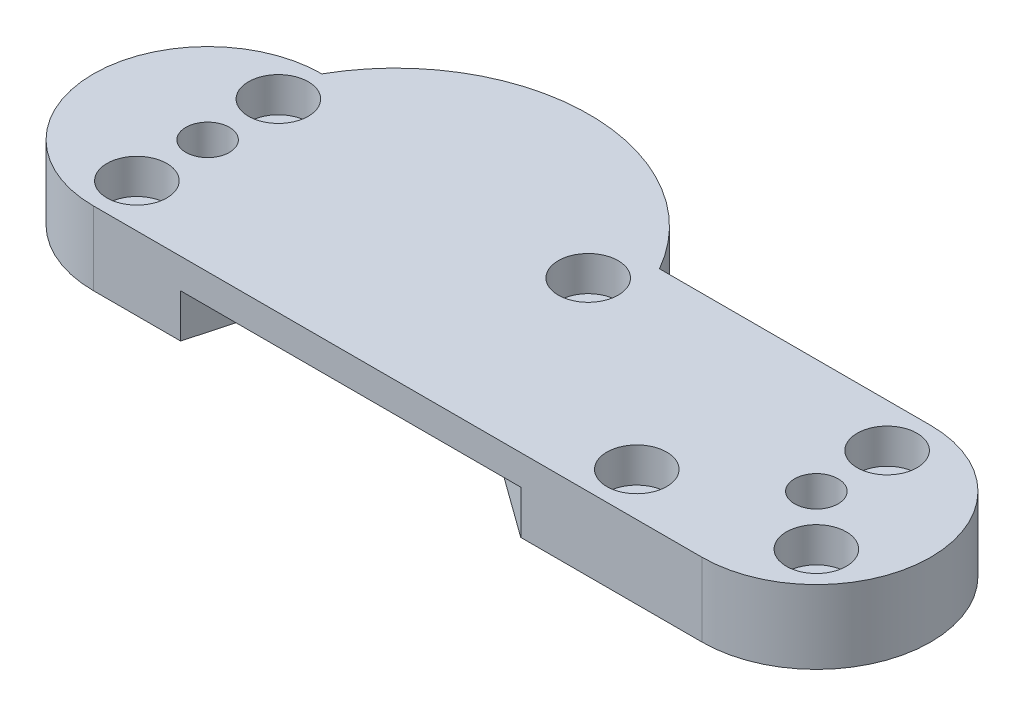
ISO-10303-21;
HEADER;
FILE_DESCRIPTION(('STEP AP214'),'2;1');
FILE_NAME('part.step','',(''),(''),'','','');
FILE_SCHEMA(('AUTOMOTIVE_DESIGN { 1 0 10303 214 1 1 1 1 }'));
ENDSEC;
DATA;
#1=APPLICATION_CONTEXT('core data for automotive mechanical design processes');
#2=APPLICATION_PROTOCOL_DEFINITION('international standard','automotive_design',2000,#1);
#3=PRODUCT_CONTEXT('',#1,'mechanical');
#4=PRODUCT('Part','Part','',(#3));
#5=PRODUCT_RELATED_PRODUCT_CATEGORY('part','',(#4));
#6=PRODUCT_DEFINITION_FORMATION('','',#4);
#7=PRODUCT_DEFINITION_CONTEXT('part definition',#1,'design');
#8=PRODUCT_DEFINITION('design','',#6,#7);
#9=PRODUCT_DEFINITION_SHAPE('','',#8);
#10=(LENGTH_UNIT() NAMED_UNIT(*) SI_UNIT(.MILLI.,.METRE.));
#11=(NAMED_UNIT(*) PLANE_ANGLE_UNIT() SI_UNIT($,.RADIAN.));
#12=(NAMED_UNIT(*) SI_UNIT($,.STERADIAN.) SOLID_ANGLE_UNIT());
#13=UNCERTAINTY_MEASURE_WITH_UNIT(LENGTH_MEASURE(1.E-05),#10,'distance_accuracy_value','');
#14=(GEOMETRIC_REPRESENTATION_CONTEXT(3) GLOBAL_UNCERTAINTY_ASSIGNED_CONTEXT((#13)) GLOBAL_UNIT_ASSIGNED_CONTEXT((#10,
#11,#12)) REPRESENTATION_CONTEXT('',''));
#15=CARTESIAN_POINT('',(0.,0.,0.));
#16=DIRECTION('',(0.,0.,1.));
#17=DIRECTION('',(1.,0.,0.));
#18=AXIS2_PLACEMENT_3D('',#15,#16,#17);
#19=CARTESIAN_POINT('',(0.,-2.,0.));
#20=DIRECTION('',(0.,1.,0.));
#21=DIRECTION('',(0.,0.,-1.));
#22=AXIS2_PLACEMENT_3D('',#19,#20,#21);
#23=PLANE('',#22);
#24=CARTESIAN_POINT('',(-10.,-2.,6.5003992165423));
#25=DIRECTION('',(0.,-1.,0.));
#26=DIRECTION('',(0.,0.,-1.));
#27=AXIS2_PLACEMENT_3D('',#24,#25,#26);
#28=CIRCLE('',#27,1.5);
#29=CARTESIAN_POINT('',(-10.,-2.,5.0003992165423));
#30=VERTEX_POINT('',#29);
#31=EDGE_CURVE('E294',#30,#30,#28,.F.);
#32=ORIENTED_EDGE('',*,*,#31,.T.);
#33=EDGE_LOOP('',(#32));
#34=FACE_BOUND('',#33,.T.);
#35=CARTESIAN_POINT('',(0.,-2.,-6.50039921654231));
#36=DIRECTION('',(0.,-1.,0.));
#37=DIRECTION('',(0.,0.,-1.));
#38=AXIS2_PLACEMENT_3D('',#35,#36,#37);
#39=CIRCLE('',#38,1.5);
#40=CARTESIAN_POINT('',(0.,-2.,-8.00039921654231));
#41=VERTEX_POINT('',#40);
#42=EDGE_CURVE('E266',#41,#41,#39,.F.);
#43=ORIENTED_EDGE('',*,*,#42,.T.);
#44=EDGE_LOOP('',(#43));
#45=FACE_BOUND('',#44,.T.);
#46=CARTESIAN_POINT('',(0.,-2.,0.));
#47=DIRECTION('',(0.,-1.,0.));
#48=DIRECTION('',(0.,0.,-1.));
#49=AXIS2_PLACEMENT_3D('',#46,#47,#48);
#50=CIRCLE('',#49,2.);
#51=CARTESIAN_POINT('',(0.,-2.,-2.));
#52=VERTEX_POINT('',#51);
#53=EDGE_CURVE('E52',#52,#52,#50,.T.);
#54=ORIENTED_EDGE('',*,*,#53,.F.);
#55=EDGE_LOOP('',(#54));
#56=FACE_BOUND('',#55,.T.);
#57=CARTESIAN_POINT('',(0.,-2.,0.));
#58=DIRECTION('',(0.,-1.,0.));
#59=DIRECTION('',(0.,0.,-1.));
#60=AXIS2_PLACEMENT_3D('',#57,#58,#59);
#61=CIRCLE('',#60,10.5003992165423);
#62=CARTESIAN_POINT('',(0.,-2.,-10.5003992165423));
#63=VERTEX_POINT('',#62);
#64=CARTESIAN_POINT('',(0.,-2.,10.5003992165423));
#65=VERTEX_POINT('',#64);
#66=EDGE_CURVE('E273',#63,#65,#61,.T.);
#67=ORIENTED_EDGE('',*,*,#66,.T.);
#68=DIRECTION('',(-1.,0.,0.));
#69=VECTOR('',#68,1.);
#70=CARTESIAN_POINT('',(0.,-2.,10.5003992165423));
#71=LINE('',#70,#69);
#72=CARTESIAN_POINT('',(-16.659276720951,-2.,10.5003992165423));
#73=VERTEX_POINT('',#72);
#74=EDGE_CURVE('E272',#65,#73,#71,.T.);
#75=ORIENTED_EDGE('',*,*,#74,.T.);
#76=DIRECTION('',(-0.810372315489383,0.,-0.585915275691269));
#77=VECTOR('',#76,1.);
#78=CARTESIAN_POINT('',(26.6452391554762,-2.,41.8104240945407));
#79=LINE('',#78,#77);
#80=CARTESIAN_POINT('',(-39.2995259463282,-2.,-5.86895054165502));
#81=VERTEX_POINT('',#80);
#82=EDGE_CURVE('E166',#73,#81,#79,.T.);
#83=ORIENTED_EDGE('',*,*,#82,.T.);
#84=DIRECTION('',(0.263153614525288,0.,-0.964753945398658));
#85=VECTOR('',#84,1.);
#86=CARTESIAN_POINT('',(-35.7518279113757,-2.,-18.8752536565782));
#87=LINE('',#86,#85);
#88=CARTESIAN_POINT('',(-35.7381547906292,-2.,-18.9253810211969));
#89=VERTEX_POINT('',#88);
#90=EDGE_CURVE('E178',#81,#89,#87,.T.);
#91=ORIENTED_EDGE('',*,*,#90,.T.);
#92=CARTESIAN_POINT('',(-40.4241193156667,-2.,-1.7460511013579));
#93=DIRECTION('',(0.,-1.,0.));
#94=DIRECTION('',(0.,0.,-1.));
#95=AXIS2_PLACEMENT_3D('',#92,#93,#94);
#96=CIRCLE('',#95,17.8069548217708);
#97=CARTESIAN_POINT('',(-24.917700351162,-2.,-10.5003992165423));
#98=VERTEX_POINT('',#97);
#99=EDGE_CURVE('E153',#89,#98,#96,.T.);
#100=ORIENTED_EDGE('',*,*,#99,.T.);
#101=DIRECTION('',(1.,0.,0.));
#102=VECTOR('',#101,1.);
#103=CARTESIAN_POINT('',(0.,-2.,-10.5003992165423));
#104=LINE('',#103,#102);
#105=EDGE_CURVE('E268',#98,#63,#104,.T.);
#106=ORIENTED_EDGE('',*,*,#105,.T.);
#107=EDGE_LOOP('',(#67,#75,#83,#91,#100,#106));
#108=FACE_BOUND('',#107,.T.);
#109=CARTESIAN_POINT('',(4.59647636643678,-2.,4.59647636643679));
#110=DIRECTION('',(0.,-1.,0.));
#111=DIRECTION('',(0.,0.,-1.));
#112=AXIS2_PLACEMENT_3D('',#109,#110,#111);
#113=CIRCLE('',#112,1.5);
#114=CARTESIAN_POINT('',(4.59647636643678,-2.,3.09647636643679));
#115=VERTEX_POINT('',#114);
#116=EDGE_CURVE('E290',#115,#115,#113,.F.);
#117=ORIENTED_EDGE('',*,*,#116,.T.);
#118=EDGE_LOOP('',(#117));
#119=FACE_BOUND('',#118,.T.);
#120=CARTESIAN_POINT('',(-27.4615510728353,-2.,-6.5003992165423));
#121=DIRECTION('',(0.,-1.,0.));
#122=DIRECTION('',(0.,0.,-1.));
#123=AXIS2_PLACEMENT_3D('',#120,#121,#122);
#124=CIRCLE('',#123,1.5);
#125=CARTESIAN_POINT('',(-27.4615510728353,-2.,-8.00039921654231));
#126=VERTEX_POINT('',#125);
#127=EDGE_CURVE('E46',#126,#126,#124,.F.);
#128=ORIENTED_EDGE('',*,*,#127,.T.);
#129=EDGE_LOOP('',(#128));
#130=FACE_BOUND('',#129,.T.);
#131=ADVANCED_FACE('F43',(#34,#45,#56,#108,#119,#130),#23,.F.);
#132=CARTESIAN_POINT('',(-55.9305382801715,-2.,6.5003992165423));
#133=DIRECTION('',(0.,-1.,0.));
#134=DIRECTION('',(0.,0.,-1.));
#135=AXIS2_PLACEMENT_3D('',#132,#133,#134);
#136=CIRCLE('',#135,1.5);
#137=CARTESIAN_POINT('',(-55.9305382801715,-2.,5.0003992165423));
#138=VERTEX_POINT('',#137);
#139=EDGE_CURVE('E298',#138,#138,#136,.F.);
#140=ORIENTED_EDGE('',*,*,#139,.T.);
#141=EDGE_LOOP('',(#140));
#142=FACE_BOUND('',#141,.T.);
#143=CARTESIAN_POINT('',(-55.9305382801715,-2.,0.));
#144=DIRECTION('',(0.,-1.,0.));
#145=DIRECTION('',(0.,0.,-1.));
#146=AXIS2_PLACEMENT_3D('',#143,#144,#145);
#147=CIRCLE('',#146,2.);
#148=CARTESIAN_POINT('',(-55.9305382801715,-2.,-2.));
#149=VERTEX_POINT('',#148);
#150=EDGE_CURVE('E11',#149,#149,#147,.T.);
#151=ORIENTED_EDGE('',*,*,#150,.F.);
#152=EDGE_LOOP('',(#151));
#153=FACE_BOUND('',#152,.T.);
#154=CARTESIAN_POINT('',(-55.9305382801715,-2.,0.));
#155=DIRECTION('',(0.,-1.,0.));
#156=DIRECTION('',(0.,0.,-1.));
#157=AXIS2_PLACEMENT_3D('',#154,#155,#156);
#158=CIRCLE('',#157,10.5003992165423);
#159=CARTESIAN_POINT('',(-55.9305382801715,-2.,10.5003992165423));
#160=VERTEX_POINT('',#159);
#161=CARTESIAN_POINT('',(-55.9305382801715,-2.,-10.5003992165423));
#162=VERTEX_POINT('',#161);
#163=EDGE_CURVE('E239',#160,#162,#158,.T.);
#164=ORIENTED_EDGE('',*,*,#163,.T.);
#165=CARTESIAN_POINT('',(-54.8543825263999,-2.,-12.1794179449777));
#166=VERTEX_POINT('',#165);
#167=EDGE_CURVE('E267',#162,#166,#96,.T.);
#168=ORIENTED_EDGE('',*,*,#167,.T.);
#169=DIRECTION('',(0.810372315489383,0.,0.585915275691269));
#170=VECTOR('',#169,1.);
#171=CARTESIAN_POINT('',(-43.8872651072943,-2.,-4.24997427651618));
#172=LINE('',#171,#170);
#173=CARTESIAN_POINT('',(-43.8872651072943,-2.,-4.24997427651618));
#174=VERTEX_POINT('',#173);
#175=EDGE_CURVE('E181',#166,#174,#172,.T.);
#176=ORIENTED_EDGE('',*,*,#175,.T.);
#177=DIRECTION('',(-0.263153614525289,0.,0.964753945398657));
#178=VECTOR('',#177,1.);
#179=CARTESIAN_POINT('',(-43.8872651072943,-2.,-4.24997427651618));
#180=LINE('',#179,#178);
#181=CARTESIAN_POINT('',(-47.9106890267398,-2.,10.5003992165423));
#182=VERTEX_POINT('',#181);
#183=EDGE_CURVE('E168',#174,#182,#180,.T.);
#184=ORIENTED_EDGE('',*,*,#183,.T.);
#185=EDGE_CURVE('E277',#182,#160,#71,.T.);
#186=ORIENTED_EDGE('',*,*,#185,.T.);
#187=EDGE_LOOP('',(#164,#168,#176,#184,#186));
#188=FACE_BOUND('',#187,.T.);
#189=CARTESIAN_POINT('',(-55.9305382801715,-2.,-6.5003992165423));
#190=DIRECTION('',(0.,-1.,0.));
#191=DIRECTION('',(0.,0.,-1.));
#192=AXIS2_PLACEMENT_3D('',#189,#190,#191);
#193=CIRCLE('',#192,1.5);
#194=CARTESIAN_POINT('',(-55.9305382801715,-2.,-8.00039921654231));
#195=VERTEX_POINT('',#194);
#196=EDGE_CURVE('E301',#195,#195,#193,.F.);
#197=ORIENTED_EDGE('',*,*,#196,.T.);
#198=EDGE_LOOP('',(#197));
#199=FACE_BOUND('',#198,.T.);
#200=ADVANCED_FACE('F315',(#142,#153,#188,#199),#23,.F.);
#201=CARTESIAN_POINT('',(-27.4615510728353,-4.75,-6.5003992165423));
#202=DIRECTION('',(0.,1.,0.));
#203=DIRECTION('',(0.,0.,-1.));
#204=AXIS2_PLACEMENT_3D('',#201,#202,#203);
#205=CYLINDRICAL_SURFACE('',#204,1.5);
#206=ORIENTED_EDGE('',*,*,#127,.F.);
#207=EDGE_LOOP('',(#206));
#208=FACE_BOUND('',#207,.T.);
#209=CARTESIAN_POINT('',(-27.4615510728353,1.55,-6.5003992165423));
#210=DIRECTION('',(0.,-1.,0.));
#211=DIRECTION('',(0.,0.,-1.));
#212=AXIS2_PLACEMENT_3D('',#209,#210,#211);
#213=CIRCLE('',#212,1.5);
#214=CARTESIAN_POINT('',(-27.4615510728353,1.55,-8.00039921654231));
#215=VERTEX_POINT('',#214);
#216=EDGE_CURVE('E149',#215,#215,#213,.F.);
#217=ORIENTED_EDGE('',*,*,#216,.T.);
#218=EDGE_LOOP('',(#217));
#219=FACE_BOUND('',#218,.T.);
#220=ADVANCED_FACE('F311',(#208,#219),#205,.F.);
#221=CARTESIAN_POINT('',(-55.9305382801715,-4.75,-6.5003992165423));
#222=DIRECTION('',(0.,1.,0.));
#223=DIRECTION('',(0.,0.,-1.));
#224=AXIS2_PLACEMENT_3D('',#221,#222,#223);
#225=CYLINDRICAL_SURFACE('',#224,1.5);
#226=ORIENTED_EDGE('',*,*,#196,.F.);
#227=EDGE_LOOP('',(#226));
#228=FACE_BOUND('',#227,.T.);
#229=CARTESIAN_POINT('',(-55.9305382801715,1.55,-6.5003992165423));
#230=DIRECTION('',(0.,-1.,0.));
#231=DIRECTION('',(0.,0.,-1.));
#232=AXIS2_PLACEMENT_3D('',#229,#230,#231);
#233=CIRCLE('',#232,1.5);
#234=CARTESIAN_POINT('',(-55.9305382801715,1.55,-8.00039921654231));
#235=VERTEX_POINT('',#234);
#236=EDGE_CURVE('E257',#235,#235,#233,.F.);
#237=ORIENTED_EDGE('',*,*,#236,.T.);
#238=EDGE_LOOP('',(#237));
#239=FACE_BOUND('',#238,.T.);
#240=ADVANCED_FACE('F314',(#228,#239),#225,.F.);
#241=CARTESIAN_POINT('',(-55.9305382801715,-4.75,6.5003992165423));
#242=DIRECTION('',(0.,1.,0.));
#243=DIRECTION('',(0.,0.,-1.));
#244=AXIS2_PLACEMENT_3D('',#241,#242,#243);
#245=CYLINDRICAL_SURFACE('',#244,1.5);
#246=ORIENTED_EDGE('',*,*,#139,.F.);
#247=EDGE_LOOP('',(#246));
#248=FACE_BOUND('',#247,.T.);
#249=CARTESIAN_POINT('',(-55.9305382801715,1.55,6.5003992165423));
#250=DIRECTION('',(0.,-1.,0.));
#251=DIRECTION('',(0.,0.,-1.));
#252=AXIS2_PLACEMENT_3D('',#249,#250,#251);
#253=CIRCLE('',#252,1.5);
#254=CARTESIAN_POINT('',(-55.9305382801715,1.55,5.0003992165423));
#255=VERTEX_POINT('',#254);
#256=EDGE_CURVE('E253',#255,#255,#253,.F.);
#257=ORIENTED_EDGE('',*,*,#256,.T.);
#258=EDGE_LOOP('',(#257));
#259=FACE_BOUND('',#258,.T.);
#260=ADVANCED_FACE('F389',(#248,#259),#245,.F.);
#261=CARTESIAN_POINT('',(-10.,-4.75,6.5003992165423));
#262=DIRECTION('',(0.,1.,0.));
#263=DIRECTION('',(0.,0.,-1.));
#264=AXIS2_PLACEMENT_3D('',#261,#262,#263);
#265=CYLINDRICAL_SURFACE('',#264,1.5);
#266=ORIENTED_EDGE('',*,*,#31,.F.);
#267=EDGE_LOOP('',(#266));
#268=FACE_BOUND('',#267,.T.);
#269=CARTESIAN_POINT('',(-10.,1.55,6.5003992165423));
#270=DIRECTION('',(0.,-1.,0.));
#271=DIRECTION('',(0.,0.,-1.));
#272=AXIS2_PLACEMENT_3D('',#269,#270,#271);
#273=CIRCLE('',#272,1.5);
#274=CARTESIAN_POINT('',(-10.,1.55,5.0003992165423));
#275=VERTEX_POINT('',#274);
#276=EDGE_CURVE('E249',#275,#275,#273,.F.);
#277=ORIENTED_EDGE('',*,*,#276,.T.);
#278=EDGE_LOOP('',(#277));
#279=FACE_BOUND('',#278,.T.);
#280=ADVANCED_FACE('F354',(#268,#279),#265,.F.);
#281=CARTESIAN_POINT('',(4.59647636643678,-4.75,4.59647636643679));
#282=DIRECTION('',(0.,1.,0.));
#283=DIRECTION('',(0.,0.,-1.));
#284=AXIS2_PLACEMENT_3D('',#281,#282,#283);
#285=CYLINDRICAL_SURFACE('',#284,1.5);
#286=ORIENTED_EDGE('',*,*,#116,.F.);
#287=EDGE_LOOP('',(#286));
#288=FACE_BOUND('',#287,.T.);
#289=CARTESIAN_POINT('',(4.59647636643678,1.55,4.59647636643679));
#290=DIRECTION('',(0.,-1.,0.));
#291=DIRECTION('',(0.,0.,-1.));
#292=AXIS2_PLACEMENT_3D('',#289,#290,#291);
#293=CIRCLE('',#292,1.5);
#294=CARTESIAN_POINT('',(4.59647636643678,1.55,3.09647636643679));
#295=VERTEX_POINT('',#294);
#296=EDGE_CURVE('E244',#295,#295,#293,.F.);
#297=ORIENTED_EDGE('',*,*,#296,.T.);
#298=EDGE_LOOP('',(#297));
#299=FACE_BOUND('',#298,.T.);
#300=ADVANCED_FACE('F350',(#288,#299),#285,.F.);
#301=CARTESIAN_POINT('',(0.,-4.75,-6.50039921654231));
#302=DIRECTION('',(0.,1.,0.));
#303=DIRECTION('',(0.,0.,-1.));
#304=AXIS2_PLACEMENT_3D('',#301,#302,#303);
#305=CYLINDRICAL_SURFACE('',#304,1.5);
#306=ORIENTED_EDGE('',*,*,#42,.F.);
#307=EDGE_LOOP('',(#306));
#308=FACE_BOUND('',#307,.T.);
#309=CARTESIAN_POINT('',(0.,1.55,-6.50039921654231));
#310=DIRECTION('',(0.,-1.,0.));
#311=DIRECTION('',(0.,0.,-1.));
#312=AXIS2_PLACEMENT_3D('',#309,#310,#311);
#313=CIRCLE('',#312,1.5);
#314=CARTESIAN_POINT('',(0.,1.55,-8.00039921654231));
#315=VERTEX_POINT('',#314);
#316=EDGE_CURVE('E240',#315,#315,#313,.F.);
#317=ORIENTED_EDGE('',*,*,#316,.T.);
#318=EDGE_LOOP('',(#317));
#319=FACE_BOUND('',#318,.T.);
#320=ADVANCED_FACE('F353',(#308,#319),#305,.F.);
#321=CARTESIAN_POINT('',(-40.4241193156667,-37.0570550282,-1.7460511013579));
#322=DIRECTION('',(0.,1.,0.));
#323=DIRECTION('',(0.,0.,-1.));
#324=AXIS2_PLACEMENT_3D('',#321,#322,#323);
#325=CYLINDRICAL_SURFACE('',#324,17.8069548217708);
#326=DIRECTION('',(0.,-1.,0.));
#327=VECTOR('',#326,1.);
#328=CARTESIAN_POINT('',(-35.7381547906292,2.,-18.9253810211969));
#329=LINE('',#328,#327);
#330=CARTESIAN_POINT('',(-35.7381547906292,2.,-18.9253810211969));
#331=VERTEX_POINT('',#330);
#332=EDGE_CURVE('E136',#331,#89,#329,.T.);
#333=ORIENTED_EDGE('',*,*,#332,.F.);
#334=CARTESIAN_POINT('',(-40.4241193156667,2.,-1.7460511013579));
#335=DIRECTION('',(0.,1.,0.));
#336=DIRECTION('',(0.,0.,1.));
#337=AXIS2_PLACEMENT_3D('',#334,#335,#336);
#338=CIRCLE('',#337,17.8069548217708);
#339=CARTESIAN_POINT('',(-54.8543825263999,2.,-12.1794179449777));
#340=VERTEX_POINT('',#339);
#341=EDGE_CURVE('E144',#331,#340,#338,.T.);
#342=ORIENTED_EDGE('',*,*,#341,.T.);
#343=DIRECTION('',(0.,-1.,0.));
#344=VECTOR('',#343,1.);
#345=CARTESIAN_POINT('',(-54.8543825263999,2.,-12.1794179449777));
#346=LINE('',#345,#344);
#347=EDGE_CURVE('E156',#340,#166,#346,.T.);
#348=ORIENTED_EDGE('',*,*,#347,.T.);
#349=ORIENTED_EDGE('',*,*,#167,.F.);
#350=DIRECTION('',(0.,1.,0.));
#351=VECTOR('',#350,1.);
#352=CARTESIAN_POINT('',(-55.9305382801715,-4.75,-10.5003992165423));
#353=LINE('',#352,#351);
#354=CARTESIAN_POINT('',(-55.9305382801715,4.75,-10.5003992165423));
#355=VERTEX_POINT('',#354);
#356=EDGE_CURVE('E220',#162,#355,#353,.T.);
#357=ORIENTED_EDGE('',*,*,#356,.T.);
#358=CARTESIAN_POINT('',(-40.4241193156667,4.75,-1.7460511013579));
#359=DIRECTION('',(0.,1.,0.));
#360=DIRECTION('',(0.,0.,1.));
#361=AXIS2_PLACEMENT_3D('',#358,#359,#360);
#362=CIRCLE('',#361,17.8069548217708);
#363=CARTESIAN_POINT('',(-24.917700351162,4.75,-10.5003992165423));
#364=VERTEX_POINT('',#363);
#365=EDGE_CURVE('E159',#355,#364,#362,.F.);
#366=ORIENTED_EDGE('',*,*,#365,.T.);
#367=DIRECTION('',(0.,1.,0.));
#368=VECTOR('',#367,1.);
#369=CARTESIAN_POINT('',(-24.917700351162,-37.0570550282,-10.5003992165423));
#370=LINE('',#369,#368);
#371=EDGE_CURVE('E60',#98,#364,#370,.T.);
#372=ORIENTED_EDGE('',*,*,#371,.F.);
#373=ORIENTED_EDGE('',*,*,#99,.F.);
#374=EDGE_LOOP('',(#333,#342,#348,#349,#357,#366,#372,#373));
#375=FACE_BOUND('',#374,.T.);
#376=ADVANCED_FACE('F151',(#375),#325,.T.);
#377=CARTESIAN_POINT('',(0.,-4.75,-10.5003992165423));
#378=DIRECTION('',(0.,0.,1.));
#379=DIRECTION('',(1.,0.,0.));
#380=AXIS2_PLACEMENT_3D('',#377,#378,#379);
#381=PLANE('',#380);
#382=ORIENTED_EDGE('',*,*,#371,.T.);
#383=DIRECTION('',(-1.,0.,0.));
#384=VECTOR('',#383,1.);
#385=CARTESIAN_POINT('',(0.,4.75,-10.5003992165423));
#386=LINE('',#385,#384);
#387=CARTESIAN_POINT('',(0.,4.75,-10.5003992165423));
#388=VERTEX_POINT('',#387);
#389=EDGE_CURVE('E204',#388,#364,#386,.T.);
#390=ORIENTED_EDGE('',*,*,#389,.F.);
#391=DIRECTION('',(0.,1.,0.));
#392=VECTOR('',#391,1.);
#393=CARTESIAN_POINT('',(0.,-4.75,-10.5003992165423));
#394=LINE('',#393,#392);
#395=EDGE_CURVE('E224',#63,#388,#394,.T.);
#396=ORIENTED_EDGE('',*,*,#395,.F.);
#397=ORIENTED_EDGE('',*,*,#105,.F.);
#398=EDGE_LOOP('',(#382,#390,#396,#397));
#399=FACE_BOUND('',#398,.T.);
#400=ADVANCED_FACE('F402',(#399),#381,.F.);
#401=CARTESIAN_POINT('',(0.,-4.75,10.5003992165423));
#402=DIRECTION('',(0.,0.,-1.));
#403=DIRECTION('',(-1.,0.,0.));
#404=AXIS2_PLACEMENT_3D('',#401,#402,#403);
#405=PLANE('',#404);
#406=DIRECTION('',(0.,1.,0.));
#407=VECTOR('',#406,1.);
#408=CARTESIAN_POINT('',(0.,-4.75,10.5003992165423));
#409=LINE('',#408,#407);
#410=CARTESIAN_POINT('',(0.,4.75,10.5003992165423));
#411=VERTEX_POINT('',#410);
#412=EDGE_CURVE('E68',#65,#411,#409,.T.);
#413=ORIENTED_EDGE('',*,*,#412,.T.);
#414=DIRECTION('',(1.,0.,0.));
#415=VECTOR('',#414,1.);
#416=CARTESIAN_POINT('',(0.,4.75,10.5003992165423));
#417=LINE('',#416,#415);
#418=CARTESIAN_POINT('',(-55.9305382801715,4.75,10.5003992165423));
#419=VERTEX_POINT('',#418);
#420=EDGE_CURVE('E210',#419,#411,#417,.T.);
#421=ORIENTED_EDGE('',*,*,#420,.F.);
#422=DIRECTION('',(0.,1.,0.));
#423=VECTOR('',#422,1.);
#424=CARTESIAN_POINT('',(-55.9305382801715,-4.75,10.5003992165423));
#425=LINE('',#424,#423);
#426=EDGE_CURVE('E216',#160,#419,#425,.T.);
#427=ORIENTED_EDGE('',*,*,#426,.F.);
#428=ORIENTED_EDGE('',*,*,#185,.F.);
#429=DIRECTION('',(0.,-1.,0.));
#430=VECTOR('',#429,1.);
#431=CARTESIAN_POINT('',(-47.9106890267398,-4.75,10.5003992165423));
#432=LINE('',#431,#430);
#433=CARTESIAN_POINT('',(-47.9106890267398,2.,10.5003992165423));
#434=VERTEX_POINT('',#433);
#435=EDGE_CURVE('E228',#434,#182,#432,.T.);
#436=ORIENTED_EDGE('',*,*,#435,.F.);
#437=DIRECTION('',(1.,0.,0.));
#438=VECTOR('',#437,1.);
#439=CARTESIAN_POINT('',(0.,2.,10.5003992165423));
#440=LINE('',#439,#438);
#441=CARTESIAN_POINT('',(-16.659276720951,2.,10.5003992165423));
#442=VERTEX_POINT('',#441);
#443=EDGE_CURVE('E235',#434,#442,#440,.T.);
#444=ORIENTED_EDGE('',*,*,#443,.T.);
#445=DIRECTION('',(0.,1.,0.));
#446=VECTOR('',#445,1.);
#447=CARTESIAN_POINT('',(-16.659276720951,-4.75,10.5003992165423));
#448=LINE('',#447,#446);
#449=EDGE_CURVE('E231',#73,#442,#448,.T.);
#450=ORIENTED_EDGE('',*,*,#449,.F.);
#451=ORIENTED_EDGE('',*,*,#74,.F.);
#452=EDGE_LOOP('',(#413,#421,#427,#428,#436,#444,#450,#451));
#453=FACE_BOUND('',#452,.T.);
#454=ADVANCED_FACE('F432',(#453),#405,.F.);
#455=CARTESIAN_POINT('',(0.,4.75,0.));
#456=DIRECTION('',(0.,-1.,0.));
#457=DIRECTION('',(0.,0.,1.));
#458=AXIS2_PLACEMENT_3D('',#455,#456,#457);
#459=PLANE('',#458);
#460=CARTESIAN_POINT('',(-55.9305382801715,4.75,-6.5003992165423));
#461=DIRECTION('',(0.,-1.,0.));
#462=DIRECTION('',(0.,0.,-1.));
#463=AXIS2_PLACEMENT_3D('',#460,#461,#462);
#464=CIRCLE('',#463,2.75);
#465=CARTESIAN_POINT('',(-55.9305382801715,4.75,-9.2503992165423));
#466=VERTEX_POINT('',#465);
#467=EDGE_CURVE('E589',#466,#466,#464,.T.);
#468=ORIENTED_EDGE('',*,*,#467,.T.);
#469=EDGE_LOOP('',(#468));
#470=FACE_BOUND('',#469,.T.);
#471=CARTESIAN_POINT('',(-27.4615510728353,4.75,-6.5003992165423));
#472=DIRECTION('',(0.,-1.,0.));
#473=DIRECTION('',(0.,0.,-1.));
#474=AXIS2_PLACEMENT_3D('',#471,#472,#473);
#475=CIRCLE('',#474,2.75);
#476=CARTESIAN_POINT('',(-27.4615510728353,4.75,-9.2503992165423));
#477=VERTEX_POINT('',#476);
#478=EDGE_CURVE('E605',#477,#477,#475,.T.);
#479=ORIENTED_EDGE('',*,*,#478,.T.);
#480=EDGE_LOOP('',(#479));
#481=FACE_BOUND('',#480,.T.);
#482=CARTESIAN_POINT('',(-10.,4.75,6.5003992165423));
#483=DIRECTION('',(0.,-1.,0.));
#484=DIRECTION('',(0.,0.,-1.));
#485=AXIS2_PLACEMENT_3D('',#482,#483,#484);
#486=CIRCLE('',#485,2.75);
#487=CARTESIAN_POINT('',(-10.,4.75,3.7503992165423));
#488=VERTEX_POINT('',#487);
#489=EDGE_CURVE('E613',#488,#488,#486,.T.);
#490=ORIENTED_EDGE('',*,*,#489,.T.);
#491=EDGE_LOOP('',(#490));
#492=FACE_BOUND('',#491,.T.);
#493=CARTESIAN_POINT('',(4.59647636643678,4.75,4.59647636643679));
#494=DIRECTION('',(0.,-1.,0.));
#495=DIRECTION('',(0.,0.,-1.));
#496=AXIS2_PLACEMENT_3D('',#493,#494,#495);
#497=CIRCLE('',#496,2.75);
#498=CARTESIAN_POINT('',(4.59647636643678,4.75,1.84647636643679));
#499=VERTEX_POINT('',#498);
#500=EDGE_CURVE('E621',#499,#499,#497,.T.);
#501=ORIENTED_EDGE('',*,*,#500,.T.);
#502=EDGE_LOOP('',(#501));
#503=FACE_BOUND('',#502,.T.);
#504=CARTESIAN_POINT('',(0.,4.75,-6.50039921654231));
#505=DIRECTION('',(0.,-1.,0.));
#506=DIRECTION('',(0.,0.,-1.));
#507=AXIS2_PLACEMENT_3D('',#504,#505,#506);
#508=CIRCLE('',#507,2.75);
#509=CARTESIAN_POINT('',(0.,4.75,-9.2503992165423));
#510=VERTEX_POINT('',#509);
#511=EDGE_CURVE('E599',#510,#510,#508,.T.);
#512=ORIENTED_EDGE('',*,*,#511,.T.);
#513=EDGE_LOOP('',(#512));
#514=FACE_BOUND('',#513,.T.);
#515=CARTESIAN_POINT('',(-55.9305382801715,4.75,6.5003992165423));
#516=DIRECTION('',(0.,-1.,0.));
#517=DIRECTION('',(0.,0.,-1.));
#518=AXIS2_PLACEMENT_3D('',#515,#516,#517);
#519=CIRCLE('',#518,2.75);
#520=CARTESIAN_POINT('',(-55.9305382801715,4.75,3.7503992165423));
#521=VERTEX_POINT('',#520);
#522=EDGE_CURVE('E588',#521,#521,#519,.T.);
#523=ORIENTED_EDGE('',*,*,#522,.T.);
#524=EDGE_LOOP('',(#523));
#525=FACE_BOUND('',#524,.T.);
#526=CARTESIAN_POINT('',(0.,4.75,0.));
#527=DIRECTION('',(0.,1.,0.));
#528=DIRECTION('',(0.,0.,1.));
#529=AXIS2_PLACEMENT_3D('',#526,#527,#528);
#530=CIRCLE('',#529,10.5003992165423);
#531=EDGE_CURVE('E201',#411,#388,#530,.T.);
#532=ORIENTED_EDGE('',*,*,#531,.T.);
#533=ORIENTED_EDGE('',*,*,#389,.T.);
#534=ORIENTED_EDGE('',*,*,#365,.F.);
#535=CARTESIAN_POINT('',(-55.9305382801715,4.75,0.));
#536=DIRECTION('',(0.,1.,0.));
#537=DIRECTION('',(0.,0.,1.));
#538=AXIS2_PLACEMENT_3D('',#535,#536,#537);
#539=CIRCLE('',#538,10.5003992165423);
#540=EDGE_CURVE('E207',#355,#419,#539,.T.);
#541=ORIENTED_EDGE('',*,*,#540,.T.);
#542=ORIENTED_EDGE('',*,*,#420,.T.);
#543=EDGE_LOOP('',(#532,#533,#534,#541,#542));
#544=FACE_BOUND('',#543,.T.);
#545=CARTESIAN_POINT('',(0.,4.75,0.));
#546=DIRECTION('',(0.,1.,0.));
#547=DIRECTION('',(0.,0.,1.));
#548=AXIS2_PLACEMENT_3D('',#545,#546,#547);
#549=CIRCLE('',#548,2.);
#550=CARTESIAN_POINT('',(0.,4.75,2.));
#551=VERTEX_POINT('',#550);
#552=EDGE_CURVE('E197',#551,#551,#549,.T.);
#553=ORIENTED_EDGE('',*,*,#552,.F.);
#554=EDGE_LOOP('',(#553));
#555=FACE_BOUND('',#554,.T.);
#556=CARTESIAN_POINT('',(-55.9305382801715,4.75,0.));
#557=DIRECTION('',(0.,1.,0.));
#558=DIRECTION('',(0.,0.,1.));
#559=AXIS2_PLACEMENT_3D('',#556,#557,#558);
#560=CIRCLE('',#559,2.);
#561=CARTESIAN_POINT('',(-55.9305382801715,4.75,2.));
#562=VERTEX_POINT('',#561);
#563=EDGE_CURVE('E191',#562,#562,#560,.T.);
#564=ORIENTED_EDGE('',*,*,#563,.F.);
#565=EDGE_LOOP('',(#564));
#566=FACE_BOUND('',#565,.T.);
#567=ADVANCED_FACE('F428',(#470,#481,#492,#503,#514,#525,#544,#555,#566),#459,.F.);
#568=CARTESIAN_POINT('',(0.,-4.75,0.));
#569=DIRECTION('',(0.,1.,0.));
#570=DIRECTION('',(0.,0.,-1.));
#571=AXIS2_PLACEMENT_3D('',#568,#569,#570);
#572=CYLINDRICAL_SURFACE('',#571,10.5003992165423);
#573=ORIENTED_EDGE('',*,*,#395,.T.);
#574=ORIENTED_EDGE('',*,*,#531,.F.);
#575=ORIENTED_EDGE('',*,*,#412,.F.);
#576=ORIENTED_EDGE('',*,*,#66,.F.);
#577=EDGE_LOOP('',(#573,#574,#575,#576));
#578=FACE_BOUND('',#577,.T.);
#579=ADVANCED_FACE('F431',(#578),#572,.T.);
#580=CARTESIAN_POINT('',(-55.9305382801715,-4.75,0.));
#581=DIRECTION('',(0.,1.,0.));
#582=DIRECTION('',(0.,0.,-1.));
#583=AXIS2_PLACEMENT_3D('',#580,#581,#582);
#584=CYLINDRICAL_SURFACE('',#583,10.5003992165423);
#585=ORIENTED_EDGE('',*,*,#426,.T.);
#586=ORIENTED_EDGE('',*,*,#540,.F.);
#587=ORIENTED_EDGE('',*,*,#356,.F.);
#588=ORIENTED_EDGE('',*,*,#163,.F.);
#589=EDGE_LOOP('',(#585,#586,#587,#588));
#590=FACE_BOUND('',#589,.T.);
#591=ADVANCED_FACE('F426',(#590),#584,.T.);
#592=CARTESIAN_POINT('',(0.,-4.75,0.));
#593=DIRECTION('',(0.,1.,0.));
#594=DIRECTION('',(0.,0.,-1.));
#595=AXIS2_PLACEMENT_3D('',#592,#593,#594);
#596=CYLINDRICAL_SURFACE('',#595,2.);
#597=ORIENTED_EDGE('',*,*,#53,.T.);
#598=EDGE_LOOP('',(#597));
#599=FACE_BOUND('',#598,.T.);
#600=ORIENTED_EDGE('',*,*,#552,.T.);
#601=EDGE_LOOP('',(#600));
#602=FACE_BOUND('',#601,.T.);
#603=ADVANCED_FACE('F422',(#599,#602),#596,.F.);
#604=CARTESIAN_POINT('',(-55.9305382801715,-4.75,0.));
#605=DIRECTION('',(0.,1.,0.));
#606=DIRECTION('',(0.,0.,-1.));
#607=AXIS2_PLACEMENT_3D('',#604,#605,#606);
#608=CYLINDRICAL_SURFACE('',#607,2.);
#609=ORIENTED_EDGE('',*,*,#150,.T.);
#610=EDGE_LOOP('',(#609));
#611=FACE_BOUND('',#610,.T.);
#612=ORIENTED_EDGE('',*,*,#563,.T.);
#613=EDGE_LOOP('',(#612));
#614=FACE_BOUND('',#613,.T.);
#615=ADVANCED_FACE('F413',(#611,#614),#608,.F.);
#616=CARTESIAN_POINT('',(-43.8872651072943,2.,-4.24997427651618));
#617=DIRECTION('',(-0.585915275691269,0.,0.810372315489383));
#618=DIRECTION('',(0.810372315489383,0.,0.585915275691269));
#619=AXIS2_PLACEMENT_3D('',#616,#617,#618);
#620=PLANE('',#619);
#621=ORIENTED_EDGE('',*,*,#175,.F.);
#622=ORIENTED_EDGE('',*,*,#347,.F.);
#623=DIRECTION('',(0.810372315489383,0.,0.585915275691269));
#624=VECTOR('',#623,1.);
#625=CARTESIAN_POINT('',(-43.8872651072943,2.,-4.24997427651618));
#626=LINE('',#625,#624);
#627=CARTESIAN_POINT('',(-43.8872651072943,2.,-4.24997427651618));
#628=VERTEX_POINT('',#627);
#629=EDGE_CURVE('E140',#340,#628,#626,.T.);
#630=ORIENTED_EDGE('',*,*,#629,.T.);
#631=DIRECTION('',(0.,-1.,0.));
#632=VECTOR('',#631,1.);
#633=CARTESIAN_POINT('',(-43.8872651072943,2.,-4.24997427651618));
#634=LINE('',#633,#632);
#635=EDGE_CURVE('E188',#628,#174,#634,.T.);
#636=ORIENTED_EDGE('',*,*,#635,.T.);
#637=EDGE_LOOP('',(#621,#622,#630,#636));
#638=FACE_BOUND('',#637,.T.);
#639=ADVANCED_FACE('F410',(#638),#620,.F.);
#640=CARTESIAN_POINT('',(-35.7518279113757,2.,-18.8752536565782));
#641=DIRECTION('',(0.964753945398658,0.,0.263153614525288));
#642=DIRECTION('',(0.263153614525288,0.,-0.964753945398658));
#643=AXIS2_PLACEMENT_3D('',#640,#641,#642);
#644=PLANE('',#643);
#645=DIRECTION('',(0.263153614525288,0.,-0.964753945398658));
#646=VECTOR('',#645,1.);
#647=CARTESIAN_POINT('',(-35.7518279113757,2.,-18.8752536565782));
#648=LINE('',#647,#646);
#649=CARTESIAN_POINT('',(-39.2995259463282,2.,-5.86895054165502));
#650=VERTEX_POINT('',#649);
#651=EDGE_CURVE('E131',#650,#331,#648,.T.);
#652=ORIENTED_EDGE('',*,*,#651,.T.);
#653=ORIENTED_EDGE('',*,*,#332,.T.);
#654=ORIENTED_EDGE('',*,*,#90,.F.);
#655=DIRECTION('',(0.,-1.,0.));
#656=VECTOR('',#655,1.);
#657=CARTESIAN_POINT('',(-39.2995259463282,2.,-5.86895054165502));
#658=LINE('',#657,#656);
#659=EDGE_CURVE('E137',#650,#81,#658,.T.);
#660=ORIENTED_EDGE('',*,*,#659,.F.);
#661=EDGE_LOOP('',(#652,#653,#654,#660));
#662=FACE_BOUND('',#661,.T.);
#663=ADVANCED_FACE('F133',(#662),#644,.F.);
#664=CARTESIAN_POINT('',(26.6452391554762,2.,41.8104240945407));
#665=DIRECTION('',(0.585915275691269,0.,-0.810372315489383));
#666=DIRECTION('',(-0.810372315489383,0.,-0.585915275691269));
#667=AXIS2_PLACEMENT_3D('',#664,#665,#666);
#668=PLANE('',#667);
#669=ORIENTED_EDGE('',*,*,#82,.F.);
#670=ORIENTED_EDGE('',*,*,#449,.T.);
#671=DIRECTION('',(-0.810372315489383,0.,-0.585915275691269));
#672=VECTOR('',#671,1.);
#673=CARTESIAN_POINT('',(26.6452391554762,2.,41.8104240945407));
#674=LINE('',#673,#672);
#675=EDGE_CURVE('E141',#442,#650,#674,.T.);
#676=ORIENTED_EDGE('',*,*,#675,.T.);
#677=ORIENTED_EDGE('',*,*,#659,.T.);
#678=EDGE_LOOP('',(#669,#670,#676,#677));
#679=FACE_BOUND('',#678,.T.);
#680=ADVANCED_FACE('F408',(#679),#668,.F.);
#681=CARTESIAN_POINT('',(-43.8872651072943,2.,-4.24997427651618));
#682=DIRECTION('',(-0.964753945398657,0.,-0.263153614525289));
#683=DIRECTION('',(-0.263153614525289,0.,0.964753945398657));
#684=AXIS2_PLACEMENT_3D('',#681,#682,#683);
#685=PLANE('',#684);
#686=DIRECTION('',(-0.263153614525289,0.,0.964753945398657));
#687=VECTOR('',#686,1.);
#688=CARTESIAN_POINT('',(-43.8872651072943,2.,-4.24997427651618));
#689=LINE('',#688,#687);
#690=EDGE_CURVE('E172',#628,#434,#689,.T.);
#691=ORIENTED_EDGE('',*,*,#690,.T.);
#692=ORIENTED_EDGE('',*,*,#435,.T.);
#693=ORIENTED_EDGE('',*,*,#183,.F.);
#694=ORIENTED_EDGE('',*,*,#635,.F.);
#695=EDGE_LOOP('',(#691,#692,#693,#694));
#696=FACE_BOUND('',#695,.T.);
#697=ADVANCED_FACE('F405',(#696),#685,.F.);
#698=CARTESIAN_POINT('',(-41.5933955268113,2.,-5.05946240908561));
#699=DIRECTION('',(0.,-1.,0.));
#700=DIRECTION('',(0.,0.,1.));
#701=AXIS2_PLACEMENT_3D('',#698,#699,#700);
#702=PLANE('',#701);
#703=ORIENTED_EDGE('',*,*,#651,.F.);
#704=ORIENTED_EDGE('',*,*,#675,.F.);
#705=ORIENTED_EDGE('',*,*,#443,.F.);
#706=ORIENTED_EDGE('',*,*,#690,.F.);
#707=ORIENTED_EDGE('',*,*,#629,.F.);
#708=ORIENTED_EDGE('',*,*,#341,.F.);
#709=EDGE_LOOP('',(#703,#704,#705,#706,#707,#708));
#710=FACE_BOUND('',#709,.T.);
#711=ADVANCED_FACE('F145',(#710),#702,.T.);
#712=CARTESIAN_POINT('',(0.,1.55,-6.50039921654231));
#713=DIRECTION('',(0.,1.,0.));
#714=DIRECTION('',(0.,0.,-1.));
#715=AXIS2_PLACEMENT_3D('',#712,#713,#714);
#716=PLANE('',#715);
#717=CARTESIAN_POINT('',(0.,1.55,-6.50039921654231));
#718=DIRECTION('',(0.,-1.,0.));
#719=DIRECTION('',(0.,0.,-1.));
#720=AXIS2_PLACEMENT_3D('',#717,#718,#719);
#721=CIRCLE('',#720,2.75);
#722=CARTESIAN_POINT('',(0.,1.55,-9.2503992165423));
#723=VERTEX_POINT('',#722);
#724=EDGE_CURVE('E625',#723,#723,#721,.T.);
#725=ORIENTED_EDGE('',*,*,#724,.F.);
#726=EDGE_LOOP('',(#725));
#727=FACE_BOUND('',#726,.T.);
#728=ORIENTED_EDGE('',*,*,#316,.F.);
#729=EDGE_LOOP('',(#728));
#730=FACE_BOUND('',#729,.T.);
#731=ADVANCED_FACE('F371',(#727,#730),#716,.T.);
#732=CARTESIAN_POINT('',(0.,1.55,-6.50039921654231));
#733=DIRECTION('',(0.,1.,0.));
#734=DIRECTION('',(0.,0.,-1.));
#735=AXIS2_PLACEMENT_3D('',#732,#733,#734);
#736=CYLINDRICAL_SURFACE('',#735,2.75);
#737=ORIENTED_EDGE('',*,*,#724,.T.);
#738=EDGE_LOOP('',(#737));
#739=FACE_BOUND('',#738,.T.);
#740=ORIENTED_EDGE('',*,*,#511,.F.);
#741=EDGE_LOOP('',(#740));
#742=FACE_BOUND('',#741,.T.);
#743=ADVANCED_FACE('F361',(#739,#742),#736,.F.);
#744=CARTESIAN_POINT('',(4.59647636643678,1.55,4.59647636643679));
#745=DIRECTION('',(0.,1.,0.));
#746=DIRECTION('',(0.,0.,-1.));
#747=AXIS2_PLACEMENT_3D('',#744,#745,#746);
#748=PLANE('',#747);
#749=CARTESIAN_POINT('',(4.59647636643678,1.55,4.59647636643679));
#750=DIRECTION('',(0.,-1.,0.));
#751=DIRECTION('',(0.,0.,-1.));
#752=AXIS2_PLACEMENT_3D('',#749,#750,#751);
#753=CIRCLE('',#752,2.75);
#754=CARTESIAN_POINT('',(4.59647636643678,1.55,1.84647636643679));
#755=VERTEX_POINT('',#754);
#756=EDGE_CURVE('E617',#755,#755,#753,.T.);
#757=ORIENTED_EDGE('',*,*,#756,.F.);
#758=EDGE_LOOP('',(#757));
#759=FACE_BOUND('',#758,.T.);
#760=ORIENTED_EDGE('',*,*,#296,.F.);
#761=EDGE_LOOP('',(#760));
#762=FACE_BOUND('',#761,.T.);
#763=ADVANCED_FACE('F358',(#759,#762),#748,.T.);
#764=CARTESIAN_POINT('',(4.59647636643678,1.55,4.59647636643679));
#765=DIRECTION('',(0.,1.,0.));
#766=DIRECTION('',(0.,0.,-1.));
#767=AXIS2_PLACEMENT_3D('',#764,#765,#766);
#768=CYLINDRICAL_SURFACE('',#767,2.75);
#769=ORIENTED_EDGE('',*,*,#756,.T.);
#770=EDGE_LOOP('',(#769));
#771=FACE_BOUND('',#770,.T.);
#772=ORIENTED_EDGE('',*,*,#500,.F.);
#773=EDGE_LOOP('',(#772));
#774=FACE_BOUND('',#773,.T.);
#775=ADVANCED_FACE('F360',(#771,#774),#768,.F.);
#776=CARTESIAN_POINT('',(-10.,1.55,6.5003992165423));
#777=DIRECTION('',(0.,1.,0.));
#778=DIRECTION('',(0.,0.,-1.));
#779=AXIS2_PLACEMENT_3D('',#776,#777,#778);
#780=PLANE('',#779);
#781=CARTESIAN_POINT('',(-10.,1.55,6.5003992165423));
#782=DIRECTION('',(0.,-1.,0.));
#783=DIRECTION('',(0.,0.,-1.));
#784=AXIS2_PLACEMENT_3D('',#781,#782,#783);
#785=CIRCLE('',#784,2.75);
#786=CARTESIAN_POINT('',(-10.,1.55,3.7503992165423));
#787=VERTEX_POINT('',#786);
#788=EDGE_CURVE('E609',#787,#787,#785,.T.);
#789=ORIENTED_EDGE('',*,*,#788,.F.);
#790=EDGE_LOOP('',(#789));
#791=FACE_BOUND('',#790,.T.);
#792=ORIENTED_EDGE('',*,*,#276,.F.);
#793=EDGE_LOOP('',(#792));
#794=FACE_BOUND('',#793,.T.);
#795=ADVANCED_FACE('F368',(#791,#794),#780,.T.);
#796=CARTESIAN_POINT('',(-10.,1.55,6.5003992165423));
#797=DIRECTION('',(0.,1.,0.));
#798=DIRECTION('',(0.,0.,-1.));
#799=AXIS2_PLACEMENT_3D('',#796,#797,#798);
#800=CYLINDRICAL_SURFACE('',#799,2.75);
#801=ORIENTED_EDGE('',*,*,#788,.T.);
#802=EDGE_LOOP('',(#801));
#803=FACE_BOUND('',#802,.T.);
#804=ORIENTED_EDGE('',*,*,#489,.F.);
#805=EDGE_LOOP('',(#804));
#806=FACE_BOUND('',#805,.T.);
#807=ADVANCED_FACE('F376',(#803,#806),#800,.F.);
#808=CARTESIAN_POINT('',(-55.9305382801715,1.55,6.5003992165423));
#809=DIRECTION('',(0.,1.,0.));
#810=DIRECTION('',(0.,0.,-1.));
#811=AXIS2_PLACEMENT_3D('',#808,#809,#810);
#812=PLANE('',#811);
#813=CARTESIAN_POINT('',(-55.9305382801715,1.55,6.5003992165423));
#814=DIRECTION('',(0.,-1.,0.));
#815=DIRECTION('',(0.,0.,-1.));
#816=AXIS2_PLACEMENT_3D('',#813,#814,#815);
#817=CIRCLE('',#816,2.75);
#818=CARTESIAN_POINT('',(-55.9305382801715,1.55,3.7503992165423));
#819=VERTEX_POINT('',#818);
#820=EDGE_CURVE('E245',#819,#819,#817,.T.);
#821=ORIENTED_EDGE('',*,*,#820,.F.);
#822=EDGE_LOOP('',(#821));
#823=FACE_BOUND('',#822,.T.);
#824=ORIENTED_EDGE('',*,*,#256,.F.);
#825=EDGE_LOOP('',(#824));
#826=FACE_BOUND('',#825,.T.);
#827=ADVANCED_FACE('F379',(#823,#826),#812,.T.);
#828=CARTESIAN_POINT('',(-55.9305382801715,1.55,6.5003992165423));
#829=DIRECTION('',(0.,1.,0.));
#830=DIRECTION('',(0.,0.,-1.));
#831=AXIS2_PLACEMENT_3D('',#828,#829,#830);
#832=CYLINDRICAL_SURFACE('',#831,2.75);
#833=ORIENTED_EDGE('',*,*,#820,.T.);
#834=EDGE_LOOP('',(#833));
#835=FACE_BOUND('',#834,.T.);
#836=ORIENTED_EDGE('',*,*,#522,.F.);
#837=EDGE_LOOP('',(#836));
#838=FACE_BOUND('',#837,.T.);
#839=ADVANCED_FACE('F382',(#835,#838),#832,.F.);
#840=CARTESIAN_POINT('',(-55.9305382801715,1.55,-6.5003992165423));
#841=DIRECTION('',(0.,1.,0.));
#842=DIRECTION('',(0.,0.,-1.));
#843=AXIS2_PLACEMENT_3D('',#840,#841,#842);
#844=PLANE('',#843);
#845=CARTESIAN_POINT('',(-55.9305382801715,1.55,-6.5003992165423));
#846=DIRECTION('',(0.,-1.,0.));
#847=DIRECTION('',(0.,0.,-1.));
#848=AXIS2_PLACEMENT_3D('',#845,#846,#847);
#849=CIRCLE('',#848,2.75);
#850=CARTESIAN_POINT('',(-55.9305382801715,1.55,-9.2503992165423));
#851=VERTEX_POINT('',#850);
#852=EDGE_CURVE('E584',#851,#851,#849,.T.);
#853=ORIENTED_EDGE('',*,*,#852,.F.);
#854=EDGE_LOOP('',(#853));
#855=FACE_BOUND('',#854,.T.);
#856=ORIENTED_EDGE('',*,*,#236,.F.);
#857=EDGE_LOOP('',(#856));
#858=FACE_BOUND('',#857,.T.);
#859=ADVANCED_FACE('F331',(#855,#858),#844,.T.);
#860=CARTESIAN_POINT('',(-55.9305382801715,1.55,-6.5003992165423));
#861=DIRECTION('',(0.,1.,0.));
#862=DIRECTION('',(0.,0.,-1.));
#863=AXIS2_PLACEMENT_3D('',#860,#861,#862);
#864=CYLINDRICAL_SURFACE('',#863,2.75);
#865=ORIENTED_EDGE('',*,*,#852,.T.);
#866=EDGE_LOOP('',(#865));
#867=FACE_BOUND('',#866,.T.);
#868=ORIENTED_EDGE('',*,*,#467,.F.);
#869=EDGE_LOOP('',(#868));
#870=FACE_BOUND('',#869,.T.);
#871=ADVANCED_FACE('F322',(#867,#870),#864,.F.);
#872=CARTESIAN_POINT('',(-27.4615510728353,1.55,-6.5003992165423));
#873=DIRECTION('',(0.,1.,0.));
#874=DIRECTION('',(0.,0.,-1.));
#875=AXIS2_PLACEMENT_3D('',#872,#873,#874);
#876=PLANE('',#875);
#877=CARTESIAN_POINT('',(-27.4615510728353,1.55,-6.5003992165423));
#878=DIRECTION('',(0.,-1.,0.));
#879=DIRECTION('',(0.,0.,-1.));
#880=AXIS2_PLACEMENT_3D('',#877,#878,#879);
#881=CIRCLE('',#880,2.75);
#882=CARTESIAN_POINT('',(-27.4615510728353,1.55,-9.2503992165423));
#883=VERTEX_POINT('',#882);
#884=EDGE_CURVE('E596',#883,#883,#881,.T.);
#885=ORIENTED_EDGE('',*,*,#884,.F.);
#886=EDGE_LOOP('',(#885));
#887=FACE_BOUND('',#886,.T.);
#888=ORIENTED_EDGE('',*,*,#216,.F.);
#889=EDGE_LOOP('',(#888));
#890=FACE_BOUND('',#889,.T.);
#891=ADVANCED_FACE('F319',(#887,#890),#876,.T.);
#892=CARTESIAN_POINT('',(-27.4615510728353,1.55,-6.5003992165423));
#893=DIRECTION('',(0.,1.,0.));
#894=DIRECTION('',(0.,0.,-1.));
#895=AXIS2_PLACEMENT_3D('',#892,#893,#894);
#896=CYLINDRICAL_SURFACE('',#895,2.75);
#897=ORIENTED_EDGE('',*,*,#884,.T.);
#898=EDGE_LOOP('',(#897));
#899=FACE_BOUND('',#898,.T.);
#900=ORIENTED_EDGE('',*,*,#478,.F.);
#901=EDGE_LOOP('',(#900));
#902=FACE_BOUND('',#901,.T.);
#903=ADVANCED_FACE('F321',(#899,#902),#896,.F.);
#904=CLOSED_SHELL('',(#131,#200,#220,#240,#260,#280,#300,#320,#376,#400,#454,#567,#579,#591,
#603,#615,#639,#663,#680,#697,#711,#731,#743,#763,#775,#795,#807,#827,#839,#859,#871,#891,#903));
#905=MANIFOLD_SOLID_BREP('B2',#904);
#906=ADVANCED_BREP_SHAPE_REPRESENTATION('',(#18,#905),#14);
#907=SHAPE_DEFINITION_REPRESENTATION(#9,#906);
ENDSEC;
END-ISO-10303-21;
